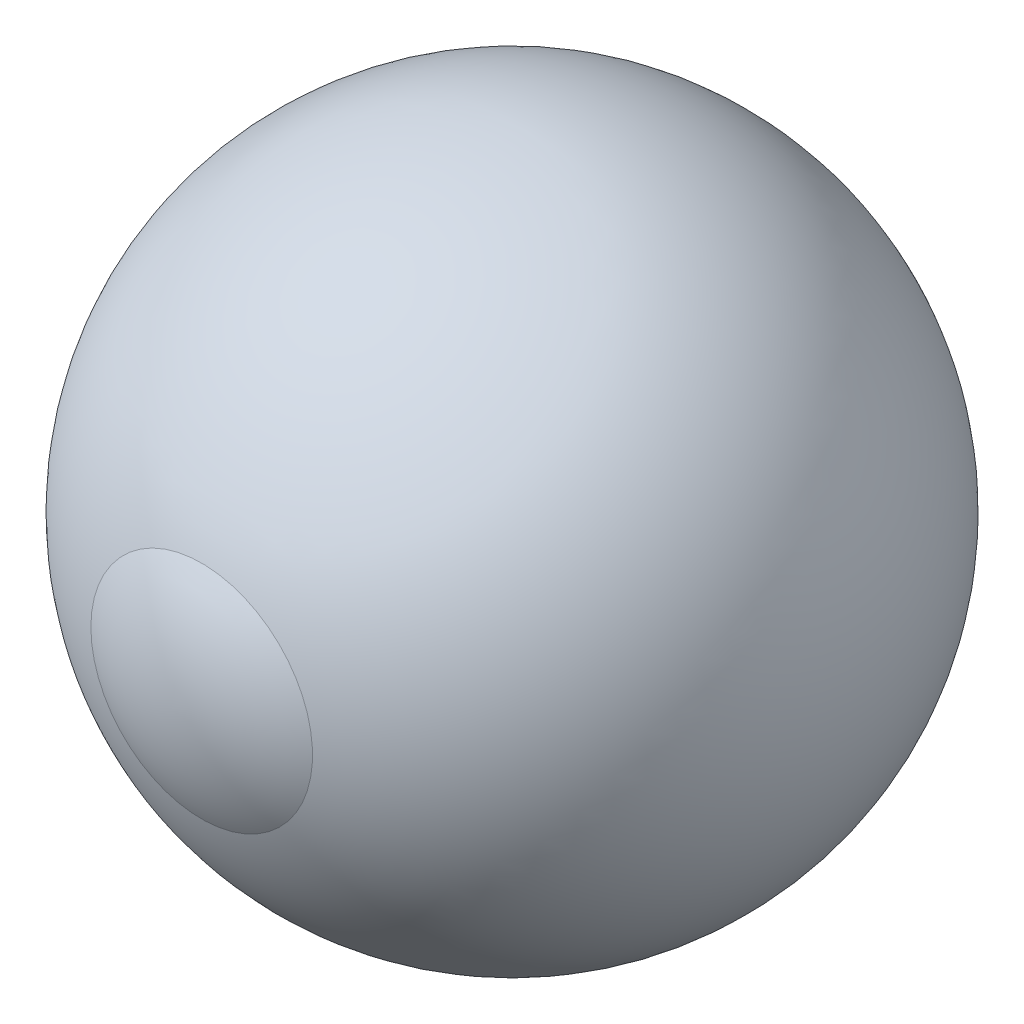
ISO-10303-21;
HEADER;
FILE_DESCRIPTION(('STEP AP214'),'2;1');
FILE_NAME('part.step','',(''),(''),'','','');
FILE_SCHEMA(('AUTOMOTIVE_DESIGN { 1 0 10303 214 1 1 1 1 }'));
ENDSEC;
DATA;
#1=APPLICATION_CONTEXT('core data for automotive mechanical design processes');
#2=APPLICATION_PROTOCOL_DEFINITION('international standard','automotive_design',2000,#1);
#3=PRODUCT_CONTEXT('',#1,'mechanical');
#4=PRODUCT('Part','Part','',(#3));
#5=PRODUCT_RELATED_PRODUCT_CATEGORY('part','',(#4));
#6=PRODUCT_DEFINITION_FORMATION('','',#4);
#7=PRODUCT_DEFINITION_CONTEXT('part definition',#1,'design');
#8=PRODUCT_DEFINITION('design','',#6,#7);
#9=PRODUCT_DEFINITION_SHAPE('','',#8);
#10=(LENGTH_UNIT() NAMED_UNIT(*) SI_UNIT(.MILLI.,.METRE.));
#11=(NAMED_UNIT(*) PLANE_ANGLE_UNIT() SI_UNIT($,.RADIAN.));
#12=(NAMED_UNIT(*) SI_UNIT($,.STERADIAN.) SOLID_ANGLE_UNIT());
#13=UNCERTAINTY_MEASURE_WITH_UNIT(LENGTH_MEASURE(1.E-05),#10,'distance_accuracy_value','');
#14=(GEOMETRIC_REPRESENTATION_CONTEXT(3) GLOBAL_UNCERTAINTY_ASSIGNED_CONTEXT((#13)) GLOBAL_UNIT_ASSIGNED_CONTEXT((#10,
#11,#12)) REPRESENTATION_CONTEXT('',''));
#15=CARTESIAN_POINT('',(0.,0.,0.));
#16=DIRECTION('',(0.,0.,1.));
#17=DIRECTION('',(1.,0.,0.));
#18=AXIS2_PLACEMENT_3D('',#15,#16,#17);
#19=CARTESIAN_POINT('',(0.,0.,0.));
#20=DIRECTION('',(0.,0.,-1.));
#21=DIRECTION('',(-1.,0.,0.));
#22=AXIS2_PLACEMENT_3D('',#19,#20,#21);
#23=SPHERICAL_SURFACE('',#22,11.8930551176862);
#24=CARTESIAN_POINT('',(0.,0.,11.2002124994271));
#25=DIRECTION('',(0.,0.,-1.));
#26=DIRECTION('',(-1.,0.,0.));
#27=AXIS2_PLACEMENT_3D('',#24,#25,#26);
#28=CIRCLE('',#27,4.00000000000001);
#29=CARTESIAN_POINT('',(-4.00000000000001,0.,11.2002124994271));
#30=VERTEX_POINT('',#29);
#31=EDGE_CURVE('E10',#30,#30,#28,.T.);
#32=ORIENTED_EDGE('',*,*,#31,.T.);
#33=EDGE_LOOP('',(#32));
#34=FACE_BOUND('',#33,.T.);
#35=ADVANCED_FACE('F31',(#34),#23,.T.);
#36=CARTESIAN_POINT('',(0.,0.,4.50394488231378));
#37=DIRECTION('',(0.,0.,-1.));
#38=DIRECTION('',(-1.,0.,0.));
#39=AXIS2_PLACEMENT_3D('',#36,#37,#38);
#40=SPHERICAL_SURFACE('',#39,7.8);
#41=ORIENTED_EDGE('',*,*,#31,.F.);
#42=EDGE_LOOP('',(#41));
#43=FACE_BOUND('',#42,.T.);
#44=ADVANCED_FACE('F39',(#43),#40,.T.);
#45=CLOSED_SHELL('',(#35,#44));
#46=MANIFOLD_SOLID_BREP('B2',#45);
#47=ADVANCED_BREP_SHAPE_REPRESENTATION('',(#18,#46),#14);
#48=SHAPE_DEFINITION_REPRESENTATION(#9,#47);
ENDSEC;
END-ISO-10303-21;
